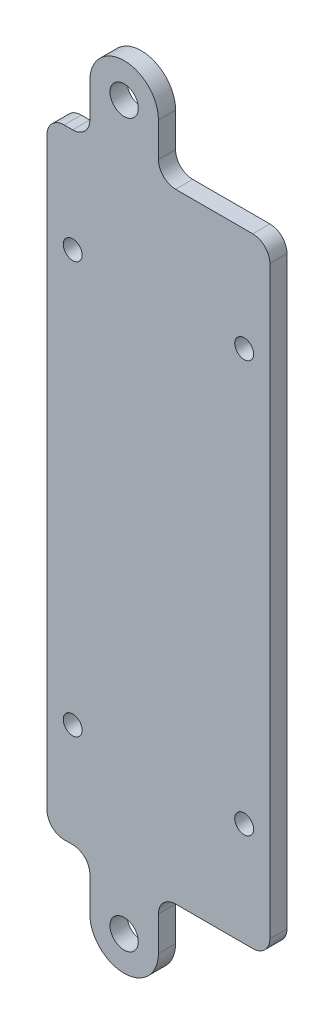
ISO-10303-21;
HEADER;
FILE_DESCRIPTION(('STEP AP214'),'2;1');
FILE_NAME('part.step','',(''),(''),'','','');
FILE_SCHEMA(('AUTOMOTIVE_DESIGN { 1 0 10303 214 1 1 1 1 }'));
ENDSEC;
DATA;
#1=APPLICATION_CONTEXT('core data for automotive mechanical design processes');
#2=APPLICATION_PROTOCOL_DEFINITION('international standard','automotive_design',2000,#1);
#3=PRODUCT_CONTEXT('',#1,'mechanical');
#4=PRODUCT('Part','Part','',(#3));
#5=PRODUCT_RELATED_PRODUCT_CATEGORY('part','',(#4));
#6=PRODUCT_DEFINITION_FORMATION('','',#4);
#7=PRODUCT_DEFINITION_CONTEXT('part definition',#1,'design');
#8=PRODUCT_DEFINITION('design','',#6,#7);
#9=PRODUCT_DEFINITION_SHAPE('','',#8);
#10=(LENGTH_UNIT() NAMED_UNIT(*) SI_UNIT(.MILLI.,.METRE.));
#11=(NAMED_UNIT(*) PLANE_ANGLE_UNIT() SI_UNIT($,.RADIAN.));
#12=(NAMED_UNIT(*) SI_UNIT($,.STERADIAN.) SOLID_ANGLE_UNIT());
#13=UNCERTAINTY_MEASURE_WITH_UNIT(LENGTH_MEASURE(1.E-05),#10,'distance_accuracy_value','');
#14=(GEOMETRIC_REPRESENTATION_CONTEXT(3) GLOBAL_UNCERTAINTY_ASSIGNED_CONTEXT((#13)) GLOBAL_UNIT_ASSIGNED_CONTEXT((#10,
#11,#12)) REPRESENTATION_CONTEXT('',''));
#15=CARTESIAN_POINT('',(0.,0.,0.));
#16=DIRECTION('',(0.,0.,1.));
#17=DIRECTION('',(1.,0.,0.));
#18=AXIS2_PLACEMENT_3D('',#15,#16,#17);
#19=CARTESIAN_POINT('',(13.,-36.1,2.));
#20=DIRECTION('',(0.,1.,0.));
#21=DIRECTION('',(0.,0.,1.));
#22=AXIS2_PLACEMENT_3D('',#19,#20,#21);
#23=PLANE('',#22);
#24=DIRECTION('',(1.,0.,0.));
#25=VECTOR('',#24,1.);
#26=CARTESIAN_POINT('',(13.,-36.1,0.));
#27=LINE('',#26,#25);
#28=CARTESIAN_POINT('',(2.00000000000001,-36.1,0.));
#29=VERTEX_POINT('',#28);
#30=CARTESIAN_POINT('',(11.,-36.1,0.));
#31=VERTEX_POINT('',#30);
#32=EDGE_CURVE('E278',#29,#31,#27,.T.);
#33=ORIENTED_EDGE('',*,*,#32,.T.);
#34=DIRECTION('',(0.,0.,-1.));
#35=VECTOR('',#34,1.);
#36=CARTESIAN_POINT('',(11.,-36.1,2.));
#37=LINE('',#36,#35);
#38=CARTESIAN_POINT('',(11.,-36.1,2.));
#39=VERTEX_POINT('',#38);
#40=EDGE_CURVE('E329',#31,#39,#37,.F.);
#41=ORIENTED_EDGE('',*,*,#40,.T.);
#42=DIRECTION('',(1.,0.,0.));
#43=VECTOR('',#42,1.);
#44=CARTESIAN_POINT('',(13.,-36.1,2.));
#45=LINE('',#44,#43);
#46=CARTESIAN_POINT('',(2.00000000000001,-36.1,2.));
#47=VERTEX_POINT('',#46);
#48=EDGE_CURVE('E264',#47,#39,#45,.T.);
#49=ORIENTED_EDGE('',*,*,#48,.F.);
#50=DIRECTION('',(0.,0.,1.));
#51=VECTOR('',#50,1.);
#52=CARTESIAN_POINT('',(2.00000000000001,-36.1,2.));
#53=LINE('',#52,#51);
#54=EDGE_CURVE('E327',#47,#29,#53,.F.);
#55=ORIENTED_EDGE('',*,*,#54,.T.);
#56=EDGE_LOOP('',(#33,#41,#49,#55));
#57=FACE_BOUND('',#56,.T.);
#58=ADVANCED_FACE('F36',(#57),#23,.F.);
#59=CARTESIAN_POINT('',(13.,36.1,2.));
#60=DIRECTION('',(0.,-1.,0.));
#61=DIRECTION('',(0.,0.,-1.));
#62=AXIS2_PLACEMENT_3D('',#59,#60,#61);
#63=PLANE('',#62);
#64=DIRECTION('',(-1.,0.,0.));
#65=VECTOR('',#64,1.);
#66=CARTESIAN_POINT('',(13.,36.1,2.));
#67=LINE('',#66,#65);
#68=CARTESIAN_POINT('',(-10.,36.1,2.));
#69=VERTEX_POINT('',#68);
#70=CARTESIAN_POINT('',(-11.,36.1,2.));
#71=VERTEX_POINT('',#70);
#72=EDGE_CURVE('E272',#69,#71,#67,.T.);
#73=ORIENTED_EDGE('',*,*,#72,.F.);
#74=DIRECTION('',(0.,0.,1.));
#75=VECTOR('',#74,1.);
#76=CARTESIAN_POINT('',(-10.,36.1,2.));
#77=LINE('',#76,#75);
#78=CARTESIAN_POINT('',(-10.,36.1,0.));
#79=VERTEX_POINT('',#78);
#80=EDGE_CURVE('E292',#69,#79,#77,.F.);
#81=ORIENTED_EDGE('',*,*,#80,.T.);
#82=DIRECTION('',(-1.,0.,0.));
#83=VECTOR('',#82,1.);
#84=CARTESIAN_POINT('',(13.,36.1,0.));
#85=LINE('',#84,#83);
#86=CARTESIAN_POINT('',(-11.,36.1,0.));
#87=VERTEX_POINT('',#86);
#88=EDGE_CURVE('E285',#79,#87,#85,.T.);
#89=ORIENTED_EDGE('',*,*,#88,.T.);
#90=DIRECTION('',(0.,0.,-1.));
#91=VECTOR('',#90,1.);
#92=CARTESIAN_POINT('',(-11.,36.1,2.));
#93=LINE('',#92,#91);
#94=EDGE_CURVE('E290',#87,#71,#93,.F.);
#95=ORIENTED_EDGE('',*,*,#94,.T.);
#96=EDGE_LOOP('',(#73,#81,#89,#95));
#97=FACE_BOUND('',#96,.T.);
#98=ADVANCED_FACE('F385',(#97),#63,.F.);
#99=CARTESIAN_POINT('',(0.,0.,2.));
#100=DIRECTION('',(0.,0.,1.));
#101=DIRECTION('',(1.,0.,0.));
#102=AXIS2_PLACEMENT_3D('',#99,#100,#101);
#103=PLANE('',#102);
#104=CARTESIAN_POINT('',(-10.,-24.,2.));
#105=DIRECTION('',(0.,0.,1.));
#106=DIRECTION('',(1.,0.,0.));
#107=AXIS2_PLACEMENT_3D('',#104,#105,#106);
#108=CIRCLE('',#107,1.1);
#109=CARTESIAN_POINT('',(-8.9,-24.,2.));
#110=VERTEX_POINT('',#109);
#111=EDGE_CURVE('E243',#110,#110,#108,.T.);
#112=ORIENTED_EDGE('',*,*,#111,.F.);
#113=EDGE_LOOP('',(#112));
#114=FACE_BOUND('',#113,.T.);
#115=CARTESIAN_POINT('',(-10.,24.,2.));
#116=DIRECTION('',(0.,0.,1.));
#117=DIRECTION('',(1.,0.,0.));
#118=AXIS2_PLACEMENT_3D('',#115,#116,#117);
#119=CIRCLE('',#118,1.1);
#120=CARTESIAN_POINT('',(-8.9,24.,2.));
#121=VERTEX_POINT('',#120);
#122=EDGE_CURVE('E255',#121,#121,#119,.T.);
#123=ORIENTED_EDGE('',*,*,#122,.F.);
#124=EDGE_LOOP('',(#123));
#125=FACE_BOUND('',#124,.T.);
#126=ORIENTED_EDGE('',*,*,#72,.T.);
#127=CARTESIAN_POINT('',(-11.,34.1,2.));
#128=DIRECTION('',(0.,0.,1.));
#129=DIRECTION('',(1.,0.,0.));
#130=AXIS2_PLACEMENT_3D('',#127,#128,#129);
#131=CIRCLE('',#130,2.);
#132=CARTESIAN_POINT('',(-13.,34.1,2.));
#133=VERTEX_POINT('',#132);
#134=EDGE_CURVE('E313',#71,#133,#131,.T.);
#135=ORIENTED_EDGE('',*,*,#134,.T.);
#136=DIRECTION('',(0.,-1.,0.));
#137=VECTOR('',#136,1.);
#138=CARTESIAN_POINT('',(-13.,-36.1,2.));
#139=LINE('',#138,#137);
#140=CARTESIAN_POINT('',(-13.,-34.1,2.));
#141=VERTEX_POINT('',#140);
#142=EDGE_CURVE('E261',#133,#141,#139,.T.);
#143=ORIENTED_EDGE('',*,*,#142,.T.);
#144=CARTESIAN_POINT('',(-11.,-34.1,2.));
#145=DIRECTION('',(0.,0.,1.));
#146=DIRECTION('',(1.,0.,0.));
#147=AXIS2_PLACEMENT_3D('',#144,#145,#146);
#148=CIRCLE('',#147,2.);
#149=CARTESIAN_POINT('',(-11.,-36.1,2.));
#150=VERTEX_POINT('',#149);
#151=EDGE_CURVE('E307',#141,#150,#148,.T.);
#152=ORIENTED_EDGE('',*,*,#151,.T.);
#153=CARTESIAN_POINT('',(-9.99999999999999,-36.1,2.));
#154=VERTEX_POINT('',#153);
#155=EDGE_CURVE('E268',#150,#154,#45,.T.);
#156=ORIENTED_EDGE('',*,*,#155,.T.);
#157=CARTESIAN_POINT('',(-9.99999999999999,-38.1,2.));
#158=DIRECTION('',(0.,0.,1.));
#159=DIRECTION('',(1.,0.,0.));
#160=AXIS2_PLACEMENT_3D('',#157,#158,#159);
#161=CIRCLE('',#160,2.);
#162=CARTESIAN_POINT('',(-7.99999999999999,-38.1,2.));
#163=VERTEX_POINT('',#162);
#164=EDGE_CURVE('E44',#154,#163,#161,.F.);
#165=ORIENTED_EDGE('',*,*,#164,.T.);
#166=DIRECTION('',(0.,-1.,0.));
#167=VECTOR('',#166,1.);
#168=CARTESIAN_POINT('',(-7.99999999999999,-42.1,2.));
#169=LINE('',#168,#167);
#170=CARTESIAN_POINT('',(-7.99999999999999,-42.1,2.));
#171=VERTEX_POINT('',#170);
#172=EDGE_CURVE('E183',#163,#171,#169,.T.);
#173=ORIENTED_EDGE('',*,*,#172,.T.);
#174=CARTESIAN_POINT('',(-3.99999999999999,-42.1,2.));
#175=DIRECTION('',(0.,0.,1.));
#176=DIRECTION('',(1.,0.,0.));
#177=AXIS2_PLACEMENT_3D('',#174,#175,#176);
#178=CIRCLE('',#177,4.);
#179=CARTESIAN_POINT('',(0.,-42.1,2.));
#180=VERTEX_POINT('',#179);
#181=EDGE_CURVE('E178',#171,#180,#178,.T.);
#182=ORIENTED_EDGE('',*,*,#181,.T.);
#183=DIRECTION('',(0.,1.,0.));
#184=VECTOR('',#183,1.);
#185=CARTESIAN_POINT('',(0.,-42.1,2.));
#186=LINE('',#185,#184);
#187=CARTESIAN_POINT('',(0.,-38.1,2.));
#188=VERTEX_POINT('',#187);
#189=EDGE_CURVE('E187',#180,#188,#186,.T.);
#190=ORIENTED_EDGE('',*,*,#189,.T.);
#191=CARTESIAN_POINT('',(2.00000000000001,-38.1,2.));
#192=DIRECTION('',(0.,0.,1.));
#193=DIRECTION('',(1.,0.,0.));
#194=AXIS2_PLACEMENT_3D('',#191,#192,#193);
#195=CIRCLE('',#194,2.);
#196=EDGE_CURVE('E347',#188,#47,#195,.F.);
#197=ORIENTED_EDGE('',*,*,#196,.T.);
#198=ORIENTED_EDGE('',*,*,#48,.T.);
#199=CARTESIAN_POINT('',(11.,-34.1,2.));
#200=DIRECTION('',(0.,0.,1.));
#201=DIRECTION('',(1.,0.,0.));
#202=AXIS2_PLACEMENT_3D('',#199,#200,#201);
#203=CIRCLE('',#202,2.);
#204=CARTESIAN_POINT('',(13.,-34.1,2.));
#205=VERTEX_POINT('',#204);
#206=EDGE_CURVE('E309',#39,#205,#203,.T.);
#207=ORIENTED_EDGE('',*,*,#206,.T.);
#208=DIRECTION('',(0.,1.,0.));
#209=VECTOR('',#208,1.);
#210=CARTESIAN_POINT('',(13.,-36.1,2.));
#211=LINE('',#210,#209);
#212=CARTESIAN_POINT('',(13.,34.1,2.));
#213=VERTEX_POINT('',#212);
#214=EDGE_CURVE('E269',#205,#213,#211,.T.);
#215=ORIENTED_EDGE('',*,*,#214,.T.);
#216=CARTESIAN_POINT('',(11.,34.1,2.));
#217=DIRECTION('',(0.,0.,1.));
#218=DIRECTION('',(1.,0.,0.));
#219=AXIS2_PLACEMENT_3D('',#216,#217,#218);
#220=CIRCLE('',#219,2.);
#221=CARTESIAN_POINT('',(11.,36.1,2.));
#222=VERTEX_POINT('',#221);
#223=EDGE_CURVE('E311',#213,#222,#220,.T.);
#224=ORIENTED_EDGE('',*,*,#223,.T.);
#225=CARTESIAN_POINT('',(2.,36.1,2.));
#226=VERTEX_POINT('',#225);
#227=EDGE_CURVE('E273',#222,#226,#67,.T.);
#228=ORIENTED_EDGE('',*,*,#227,.T.);
#229=CARTESIAN_POINT('',(2.,38.1,2.));
#230=DIRECTION('',(0.,0.,1.));
#231=DIRECTION('',(1.,0.,0.));
#232=AXIS2_PLACEMENT_3D('',#229,#230,#231);
#233=CIRCLE('',#232,2.);
#234=CARTESIAN_POINT('',(0.,38.1,2.));
#235=VERTEX_POINT('',#234);
#236=EDGE_CURVE('E51',#226,#235,#233,.F.);
#237=ORIENTED_EDGE('',*,*,#236,.T.);
#238=DIRECTION('',(0.,1.,0.));
#239=VECTOR('',#238,1.);
#240=CARTESIAN_POINT('',(0.,42.1,2.));
#241=LINE('',#240,#239);
#242=CARTESIAN_POINT('',(0.,42.1,2.));
#243=VERTEX_POINT('',#242);
#244=EDGE_CURVE('E228',#235,#243,#241,.T.);
#245=ORIENTED_EDGE('',*,*,#244,.T.);
#246=CARTESIAN_POINT('',(-4.,42.1,2.));
#247=DIRECTION('',(0.,0.,1.));
#248=DIRECTION('',(1.,0.,0.));
#249=AXIS2_PLACEMENT_3D('',#246,#247,#248);
#250=CIRCLE('',#249,4.);
#251=CARTESIAN_POINT('',(-8.,42.1,2.));
#252=VERTEX_POINT('',#251);
#253=EDGE_CURVE('E222',#243,#252,#250,.T.);
#254=ORIENTED_EDGE('',*,*,#253,.T.);
#255=DIRECTION('',(0.,-1.,0.));
#256=VECTOR('',#255,1.);
#257=CARTESIAN_POINT('',(-8.,42.1,2.));
#258=LINE('',#257,#256);
#259=CARTESIAN_POINT('',(-8.00000000000001,38.1,2.));
#260=VERTEX_POINT('',#259);
#261=EDGE_CURVE('E225',#252,#260,#258,.T.);
#262=ORIENTED_EDGE('',*,*,#261,.T.);
#263=CARTESIAN_POINT('',(-10.,38.1,2.));
#264=DIRECTION('',(0.,0.,1.));
#265=DIRECTION('',(1.,0.,0.));
#266=AXIS2_PLACEMENT_3D('',#263,#264,#265);
#267=CIRCLE('',#266,2.);
#268=EDGE_CURVE('E340',#260,#69,#267,.F.);
#269=ORIENTED_EDGE('',*,*,#268,.T.);
#270=EDGE_LOOP('',(#126,#135,#143,#152,#156,#165,#173,#182,#190,#197,#198,#207,#215,#224,#228,
#237,#245,#254,#262,#269));
#271=FACE_BOUND('',#270,.T.);
#272=CARTESIAN_POINT('',(10.,24.,2.));
#273=DIRECTION('',(0.,0.,1.));
#274=DIRECTION('',(1.,0.,0.));
#275=AXIS2_PLACEMENT_3D('',#272,#273,#274);
#276=CIRCLE('',#275,1.1);
#277=CARTESIAN_POINT('',(11.1,24.,2.));
#278=VERTEX_POINT('',#277);
#279=EDGE_CURVE('E249',#278,#278,#276,.T.);
#280=ORIENTED_EDGE('',*,*,#279,.F.);
#281=EDGE_LOOP('',(#280));
#282=FACE_BOUND('',#281,.T.);
#283=CARTESIAN_POINT('',(10.,-24.,2.));
#284=DIRECTION('',(0.,0.,1.));
#285=DIRECTION('',(1.,0.,0.));
#286=AXIS2_PLACEMENT_3D('',#283,#284,#285);
#287=CIRCLE('',#286,1.1);
#288=CARTESIAN_POINT('',(11.1,-24.,2.));
#289=VERTEX_POINT('',#288);
#290=EDGE_CURVE('E237',#289,#289,#287,.T.);
#291=ORIENTED_EDGE('',*,*,#290,.F.);
#292=EDGE_LOOP('',(#291));
#293=FACE_BOUND('',#292,.T.);
#294=CARTESIAN_POINT('',(-4.,42.1,2.));
#295=DIRECTION('',(0.,0.,1.));
#296=DIRECTION('',(1.,0.,0.));
#297=AXIS2_PLACEMENT_3D('',#294,#295,#296);
#298=CIRCLE('',#297,1.65);
#299=CARTESIAN_POINT('',(-2.35,42.1,2.));
#300=VERTEX_POINT('',#299);
#301=EDGE_CURVE('E209',#300,#300,#298,.T.);
#302=ORIENTED_EDGE('',*,*,#301,.F.);
#303=EDGE_LOOP('',(#302));
#304=FACE_BOUND('',#303,.T.);
#305=CARTESIAN_POINT('',(-3.99999999999999,-42.1,2.));
#306=DIRECTION('',(0.,0.,1.));
#307=DIRECTION('',(1.,0.,0.));
#308=AXIS2_PLACEMENT_3D('',#305,#306,#307);
#309=CIRCLE('',#308,1.65);
#310=CARTESIAN_POINT('',(-2.34999999999999,-42.1,2.));
#311=VERTEX_POINT('',#310);
#312=EDGE_CURVE('E197',#311,#311,#309,.T.);
#313=ORIENTED_EDGE('',*,*,#312,.F.);
#314=EDGE_LOOP('',(#313));
#315=FACE_BOUND('',#314,.T.);
#316=ADVANCED_FACE('F193',(#114,#125,#271,#282,#293,#304,#315),#103,.T.);
#317=CARTESIAN_POINT('',(0.,0.,0.));
#318=DIRECTION('',(0.,0.,1.));
#319=DIRECTION('',(1.,0.,0.));
#320=AXIS2_PLACEMENT_3D('',#317,#318,#319);
#321=PLANE('',#320);
#322=DIRECTION('',(0.,-1.,0.));
#323=VECTOR('',#322,1.);
#324=CARTESIAN_POINT('',(-13.,-36.1,0.));
#325=LINE('',#324,#323);
#326=CARTESIAN_POINT('',(-13.,34.1,0.));
#327=VERTEX_POINT('',#326);
#328=CARTESIAN_POINT('',(-13.,-34.1,0.));
#329=VERTEX_POINT('',#328);
#330=EDGE_CURVE('E258',#327,#329,#325,.T.);
#331=ORIENTED_EDGE('',*,*,#330,.F.);
#332=CARTESIAN_POINT('',(-11.,34.1,0.));
#333=DIRECTION('',(0.,0.,1.));
#334=DIRECTION('',(1.,0.,0.));
#335=AXIS2_PLACEMENT_3D('',#332,#333,#334);
#336=CIRCLE('',#335,2.);
#337=EDGE_CURVE('E305',#327,#87,#336,.F.);
#338=ORIENTED_EDGE('',*,*,#337,.T.);
#339=ORIENTED_EDGE('',*,*,#88,.F.);
#340=CARTESIAN_POINT('',(-10.,38.1,0.));
#341=DIRECTION('',(0.,0.,1.));
#342=DIRECTION('',(1.,0.,0.));
#343=AXIS2_PLACEMENT_3D('',#340,#341,#342);
#344=CIRCLE('',#343,2.);
#345=CARTESIAN_POINT('',(-8.00000000000001,38.1,0.));
#346=VERTEX_POINT('',#345);
#347=EDGE_CURVE('E342',#79,#346,#344,.T.);
#348=ORIENTED_EDGE('',*,*,#347,.T.);
#349=DIRECTION('',(0.,1.,0.));
#350=VECTOR('',#349,1.);
#351=CARTESIAN_POINT('',(-8.,42.1,0.));
#352=LINE('',#351,#350);
#353=CARTESIAN_POINT('',(-8.,42.1,0.));
#354=VERTEX_POINT('',#353);
#355=EDGE_CURVE('E211',#346,#354,#352,.T.);
#356=ORIENTED_EDGE('',*,*,#355,.T.);
#357=CARTESIAN_POINT('',(-4.,42.1,0.));
#358=DIRECTION('',(0.,0.,1.));
#359=DIRECTION('',(1.,0.,0.));
#360=AXIS2_PLACEMENT_3D('',#357,#358,#359);
#361=CIRCLE('',#360,4.);
#362=CARTESIAN_POINT('',(0.,42.1,0.));
#363=VERTEX_POINT('',#362);
#364=EDGE_CURVE('E214',#354,#363,#361,.F.);
#365=ORIENTED_EDGE('',*,*,#364,.T.);
#366=DIRECTION('',(0.,-1.,0.));
#367=VECTOR('',#366,1.);
#368=CARTESIAN_POINT('',(0.,42.1,0.));
#369=LINE('',#368,#367);
#370=CARTESIAN_POINT('',(0.,38.1,0.));
#371=VERTEX_POINT('',#370);
#372=EDGE_CURVE('E215',#363,#371,#369,.T.);
#373=ORIENTED_EDGE('',*,*,#372,.T.);
#374=CARTESIAN_POINT('',(2.,38.1,0.));
#375=DIRECTION('',(0.,0.,1.));
#376=DIRECTION('',(1.,0.,0.));
#377=AXIS2_PLACEMENT_3D('',#374,#375,#376);
#378=CIRCLE('',#377,2.);
#379=CARTESIAN_POINT('',(2.,36.1,0.));
#380=VERTEX_POINT('',#379);
#381=EDGE_CURVE('E345',#371,#380,#378,.T.);
#382=ORIENTED_EDGE('',*,*,#381,.T.);
#383=CARTESIAN_POINT('',(11.,36.1,0.));
#384=VERTEX_POINT('',#383);
#385=EDGE_CURVE('E265',#384,#380,#85,.T.);
#386=ORIENTED_EDGE('',*,*,#385,.F.);
#387=CARTESIAN_POINT('',(11.,34.1,0.));
#388=DIRECTION('',(0.,0.,1.));
#389=DIRECTION('',(1.,0.,0.));
#390=AXIS2_PLACEMENT_3D('',#387,#388,#389);
#391=CIRCLE('',#390,2.);
#392=CARTESIAN_POINT('',(13.,34.1,0.));
#393=VERTEX_POINT('',#392);
#394=EDGE_CURVE('E303',#384,#393,#391,.F.);
#395=ORIENTED_EDGE('',*,*,#394,.T.);
#396=DIRECTION('',(0.,1.,0.));
#397=VECTOR('',#396,1.);
#398=CARTESIAN_POINT('',(13.,-36.1,0.));
#399=LINE('',#398,#397);
#400=CARTESIAN_POINT('',(13.,-34.1,0.));
#401=VERTEX_POINT('',#400);
#402=EDGE_CURVE('E282',#401,#393,#399,.T.);
#403=ORIENTED_EDGE('',*,*,#402,.F.);
#404=CARTESIAN_POINT('',(11.,-34.1,0.));
#405=DIRECTION('',(0.,0.,1.));
#406=DIRECTION('',(1.,0.,0.));
#407=AXIS2_PLACEMENT_3D('',#404,#405,#406);
#408=CIRCLE('',#407,2.);
#409=EDGE_CURVE('E301',#401,#31,#408,.F.);
#410=ORIENTED_EDGE('',*,*,#409,.T.);
#411=ORIENTED_EDGE('',*,*,#32,.F.);
#412=CARTESIAN_POINT('',(2.00000000000001,-38.1,0.));
#413=DIRECTION('',(0.,0.,1.));
#414=DIRECTION('',(1.,0.,0.));
#415=AXIS2_PLACEMENT_3D('',#412,#413,#414);
#416=CIRCLE('',#415,2.);
#417=CARTESIAN_POINT('',(0.,-38.1,0.));
#418=VERTEX_POINT('',#417);
#419=EDGE_CURVE('E349',#29,#418,#416,.T.);
#420=ORIENTED_EDGE('',*,*,#419,.T.);
#421=DIRECTION('',(0.,-1.,0.));
#422=VECTOR('',#421,1.);
#423=CARTESIAN_POINT('',(0.,-42.1,0.));
#424=LINE('',#423,#422);
#425=CARTESIAN_POINT('',(0.,-42.1,0.));
#426=VERTEX_POINT('',#425);
#427=EDGE_CURVE('E210',#418,#426,#424,.T.);
#428=ORIENTED_EDGE('',*,*,#427,.T.);
#429=CARTESIAN_POINT('',(-3.99999999999999,-42.1,0.));
#430=DIRECTION('',(0.,0.,1.));
#431=DIRECTION('',(1.,0.,0.));
#432=AXIS2_PLACEMENT_3D('',#429,#430,#431);
#433=CIRCLE('',#432,4.);
#434=CARTESIAN_POINT('',(-7.99999999999999,-42.1,0.));
#435=VERTEX_POINT('',#434);
#436=EDGE_CURVE('E179',#426,#435,#433,.F.);
#437=ORIENTED_EDGE('',*,*,#436,.T.);
#438=DIRECTION('',(0.,1.,0.));
#439=VECTOR('',#438,1.);
#440=CARTESIAN_POINT('',(-7.99999999999999,-42.1,0.));
#441=LINE('',#440,#439);
#442=CARTESIAN_POINT('',(-7.99999999999999,-38.1,0.));
#443=VERTEX_POINT('',#442);
#444=EDGE_CURVE('E204',#435,#443,#441,.T.);
#445=ORIENTED_EDGE('',*,*,#444,.T.);
#446=CARTESIAN_POINT('',(-9.99999999999999,-38.1,0.));
#447=DIRECTION('',(0.,0.,1.));
#448=DIRECTION('',(1.,0.,0.));
#449=AXIS2_PLACEMENT_3D('',#446,#447,#448);
#450=CIRCLE('',#449,2.);
#451=CARTESIAN_POINT('',(-9.99999999999999,-36.1,0.));
#452=VERTEX_POINT('',#451);
#453=EDGE_CURVE('E11',#443,#452,#450,.T.);
#454=ORIENTED_EDGE('',*,*,#453,.T.);
#455=CARTESIAN_POINT('',(-11.,-36.1,0.));
#456=VERTEX_POINT('',#455);
#457=EDGE_CURVE('E279',#456,#452,#27,.T.);
#458=ORIENTED_EDGE('',*,*,#457,.F.);
#459=CARTESIAN_POINT('',(-11.,-34.1,0.));
#460=DIRECTION('',(0.,0.,1.));
#461=DIRECTION('',(1.,0.,0.));
#462=AXIS2_PLACEMENT_3D('',#459,#460,#461);
#463=CIRCLE('',#462,2.);
#464=EDGE_CURVE('E299',#456,#329,#463,.F.);
#465=ORIENTED_EDGE('',*,*,#464,.T.);
#466=EDGE_LOOP('',(#331,#338,#339,#348,#356,#365,#373,#382,#386,#395,#403,#410,#411,#420,#428,
#437,#445,#454,#458,#465));
#467=FACE_BOUND('',#466,.T.);
#468=CARTESIAN_POINT('',(-10.,24.,0.));
#469=DIRECTION('',(0.,0.,1.));
#470=DIRECTION('',(1.,0.,0.));
#471=AXIS2_PLACEMENT_3D('',#468,#469,#470);
#472=CIRCLE('',#471,1.1);
#473=CARTESIAN_POINT('',(-8.9,24.,0.));
#474=VERTEX_POINT('',#473);
#475=EDGE_CURVE('E252',#474,#474,#472,.T.);
#476=ORIENTED_EDGE('',*,*,#475,.T.);
#477=EDGE_LOOP('',(#476));
#478=FACE_BOUND('',#477,.T.);
#479=CARTESIAN_POINT('',(10.,24.,0.));
#480=DIRECTION('',(0.,0.,1.));
#481=DIRECTION('',(1.,0.,0.));
#482=AXIS2_PLACEMENT_3D('',#479,#480,#481);
#483=CIRCLE('',#482,1.1);
#484=CARTESIAN_POINT('',(11.1,24.,0.));
#485=VERTEX_POINT('',#484);
#486=EDGE_CURVE('E246',#485,#485,#483,.T.);
#487=ORIENTED_EDGE('',*,*,#486,.T.);
#488=EDGE_LOOP('',(#487));
#489=FACE_BOUND('',#488,.T.);
#490=CARTESIAN_POINT('',(-10.,-24.,0.));
#491=DIRECTION('',(0.,0.,1.));
#492=DIRECTION('',(1.,0.,0.));
#493=AXIS2_PLACEMENT_3D('',#490,#491,#492);
#494=CIRCLE('',#493,1.1);
#495=CARTESIAN_POINT('',(-8.9,-24.,0.));
#496=VERTEX_POINT('',#495);
#497=EDGE_CURVE('E240',#496,#496,#494,.T.);
#498=ORIENTED_EDGE('',*,*,#497,.T.);
#499=EDGE_LOOP('',(#498));
#500=FACE_BOUND('',#499,.T.);
#501=CARTESIAN_POINT('',(10.,-24.,0.));
#502=DIRECTION('',(0.,0.,1.));
#503=DIRECTION('',(1.,0.,0.));
#504=AXIS2_PLACEMENT_3D('',#501,#502,#503);
#505=CIRCLE('',#504,1.1);
#506=CARTESIAN_POINT('',(11.1,-24.,0.));
#507=VERTEX_POINT('',#506);
#508=EDGE_CURVE('E236',#507,#507,#505,.T.);
#509=ORIENTED_EDGE('',*,*,#508,.T.);
#510=EDGE_LOOP('',(#509));
#511=FACE_BOUND('',#510,.T.);
#512=CARTESIAN_POINT('',(-4.,42.1,0.));
#513=DIRECTION('',(0.,0.,1.));
#514=DIRECTION('',(1.,0.,0.));
#515=AXIS2_PLACEMENT_3D('',#512,#513,#514);
#516=CIRCLE('',#515,1.65);
#517=CARTESIAN_POINT('',(-2.35,42.1,0.));
#518=VERTEX_POINT('',#517);
#519=EDGE_CURVE('E213',#518,#518,#516,.F.);
#520=ORIENTED_EDGE('',*,*,#519,.F.);
#521=EDGE_LOOP('',(#520));
#522=FACE_BOUND('',#521,.T.);
#523=CARTESIAN_POINT('',(-3.99999999999999,-42.1,0.));
#524=DIRECTION('',(0.,0.,1.));
#525=DIRECTION('',(1.,0.,0.));
#526=AXIS2_PLACEMENT_3D('',#523,#524,#525);
#527=CIRCLE('',#526,1.65);
#528=CARTESIAN_POINT('',(-2.34999999999999,-42.1,0.));
#529=VERTEX_POINT('',#528);
#530=EDGE_CURVE('E206',#529,#529,#527,.F.);
#531=ORIENTED_EDGE('',*,*,#530,.F.);
#532=EDGE_LOOP('',(#531));
#533=FACE_BOUND('',#532,.T.);
#534=ADVANCED_FACE('F363',(#467,#478,#489,#500,#511,#522,#533),#321,.F.);
#535=CARTESIAN_POINT('',(-13.,-36.1,2.));
#536=DIRECTION('',(1.,0.,0.));
#537=DIRECTION('',(0.,0.,-1.));
#538=AXIS2_PLACEMENT_3D('',#535,#536,#537);
#539=PLANE('',#538);
#540=ORIENTED_EDGE('',*,*,#142,.F.);
#541=DIRECTION('',(0.,0.,-1.));
#542=VECTOR('',#541,1.);
#543=CARTESIAN_POINT('',(-13.,34.1,2.));
#544=LINE('',#543,#542);
#545=EDGE_CURVE('E296',#133,#327,#544,.T.);
#546=ORIENTED_EDGE('',*,*,#545,.T.);
#547=ORIENTED_EDGE('',*,*,#330,.T.);
#548=DIRECTION('',(0.,0.,-1.));
#549=VECTOR('',#548,1.);
#550=CARTESIAN_POINT('',(-13.,-34.1,2.));
#551=LINE('',#550,#549);
#552=EDGE_CURVE('E294',#329,#141,#551,.F.);
#553=ORIENTED_EDGE('',*,*,#552,.T.);
#554=EDGE_LOOP('',(#540,#546,#547,#553));
#555=FACE_BOUND('',#554,.T.);
#556=ADVANCED_FACE('F374',(#555),#539,.F.);
#557=ORIENTED_EDGE('',*,*,#155,.F.);
#558=DIRECTION('',(0.,0.,-1.));
#559=VECTOR('',#558,1.);
#560=CARTESIAN_POINT('',(-11.,-36.1,2.));
#561=LINE('',#560,#559);
#562=EDGE_CURVE('E335',#150,#456,#561,.T.);
#563=ORIENTED_EDGE('',*,*,#562,.T.);
#564=ORIENTED_EDGE('',*,*,#457,.T.);
#565=DIRECTION('',(0.,0.,1.));
#566=VECTOR('',#565,1.);
#567=CARTESIAN_POINT('',(-9.99999999999999,-36.1,2.));
#568=LINE('',#567,#566);
#569=EDGE_CURVE('E332',#452,#154,#568,.T.);
#570=ORIENTED_EDGE('',*,*,#569,.T.);
#571=EDGE_LOOP('',(#557,#563,#564,#570));
#572=FACE_BOUND('',#571,.T.);
#573=ADVANCED_FACE('F366',(#572),#23,.F.);
#574=CARTESIAN_POINT('',(13.,-36.1,2.));
#575=DIRECTION('',(-1.,0.,0.));
#576=DIRECTION('',(0.,0.,1.));
#577=AXIS2_PLACEMENT_3D('',#574,#575,#576);
#578=PLANE('',#577);
#579=ORIENTED_EDGE('',*,*,#402,.T.);
#580=DIRECTION('',(0.,0.,-1.));
#581=VECTOR('',#580,1.);
#582=CARTESIAN_POINT('',(13.,34.1,2.));
#583=LINE('',#582,#581);
#584=EDGE_CURVE('E325',#393,#213,#583,.F.);
#585=ORIENTED_EDGE('',*,*,#584,.T.);
#586=ORIENTED_EDGE('',*,*,#214,.F.);
#587=DIRECTION('',(0.,0.,-1.));
#588=VECTOR('',#587,1.);
#589=CARTESIAN_POINT('',(13.,-34.1,2.));
#590=LINE('',#589,#588);
#591=EDGE_CURVE('E322',#205,#401,#590,.T.);
#592=ORIENTED_EDGE('',*,*,#591,.T.);
#593=EDGE_LOOP('',(#579,#585,#586,#592));
#594=FACE_BOUND('',#593,.T.);
#595=ADVANCED_FACE('F416',(#594),#578,.F.);
#596=ORIENTED_EDGE('',*,*,#385,.T.);
#597=DIRECTION('',(0.,0.,1.));
#598=VECTOR('',#597,1.);
#599=CARTESIAN_POINT('',(2.,36.1,2.));
#600=LINE('',#599,#598);
#601=EDGE_CURVE('E318',#380,#226,#600,.T.);
#602=ORIENTED_EDGE('',*,*,#601,.T.);
#603=ORIENTED_EDGE('',*,*,#227,.F.);
#604=DIRECTION('',(0.,0.,-1.));
#605=VECTOR('',#604,1.);
#606=CARTESIAN_POINT('',(11.,36.1,2.));
#607=LINE('',#606,#605);
#608=EDGE_CURVE('E315',#222,#384,#607,.T.);
#609=ORIENTED_EDGE('',*,*,#608,.T.);
#610=EDGE_LOOP('',(#596,#602,#603,#609));
#611=FACE_BOUND('',#610,.T.);
#612=ADVANCED_FACE('F407',(#611),#63,.F.);
#613=CARTESIAN_POINT('',(-10.,24.,2.));
#614=DIRECTION('',(0.,0.,-1.));
#615=DIRECTION('',(-1.,0.,0.));
#616=AXIS2_PLACEMENT_3D('',#613,#614,#615);
#617=CYLINDRICAL_SURFACE('',#616,1.1);
#618=ORIENTED_EDGE('',*,*,#122,.T.);
#619=EDGE_LOOP('',(#618));
#620=FACE_BOUND('',#619,.T.);
#621=ORIENTED_EDGE('',*,*,#475,.F.);
#622=EDGE_LOOP('',(#621));
#623=FACE_BOUND('',#622,.T.);
#624=ADVANCED_FACE('F605',(#620,#623),#617,.F.);
#625=CARTESIAN_POINT('',(10.,24.,2.));
#626=DIRECTION('',(0.,0.,-1.));
#627=DIRECTION('',(-1.,0.,0.));
#628=AXIS2_PLACEMENT_3D('',#625,#626,#627);
#629=CYLINDRICAL_SURFACE('',#628,1.1);
#630=ORIENTED_EDGE('',*,*,#279,.T.);
#631=EDGE_LOOP('',(#630));
#632=FACE_BOUND('',#631,.T.);
#633=ORIENTED_EDGE('',*,*,#486,.F.);
#634=EDGE_LOOP('',(#633));
#635=FACE_BOUND('',#634,.T.);
#636=ADVANCED_FACE('F614',(#632,#635),#629,.F.);
#637=CARTESIAN_POINT('',(-10.,-24.,2.));
#638=DIRECTION('',(0.,0.,-1.));
#639=DIRECTION('',(-1.,0.,0.));
#640=AXIS2_PLACEMENT_3D('',#637,#638,#639);
#641=CYLINDRICAL_SURFACE('',#640,1.1);
#642=ORIENTED_EDGE('',*,*,#111,.T.);
#643=EDGE_LOOP('',(#642));
#644=FACE_BOUND('',#643,.T.);
#645=ORIENTED_EDGE('',*,*,#497,.F.);
#646=EDGE_LOOP('',(#645));
#647=FACE_BOUND('',#646,.T.);
#648=ADVANCED_FACE('F621',(#644,#647),#641,.F.);
#649=CARTESIAN_POINT('',(10.,-24.,2.));
#650=DIRECTION('',(0.,0.,-1.));
#651=DIRECTION('',(-1.,0.,0.));
#652=AXIS2_PLACEMENT_3D('',#649,#650,#651);
#653=CYLINDRICAL_SURFACE('',#652,1.1);
#654=ORIENTED_EDGE('',*,*,#290,.T.);
#655=EDGE_LOOP('',(#654));
#656=FACE_BOUND('',#655,.T.);
#657=ORIENTED_EDGE('',*,*,#508,.F.);
#658=EDGE_LOOP('',(#657));
#659=FACE_BOUND('',#658,.T.);
#660=ADVANCED_FACE('F570',(#656,#659),#653,.F.);
#661=CARTESIAN_POINT('',(-8.,42.1,-12.8062484748657));
#662=DIRECTION('',(-1.,0.,0.));
#663=DIRECTION('',(0.,-1.,0.));
#664=AXIS2_PLACEMENT_3D('',#661,#662,#663);
#665=PLANE('',#664);
#666=ORIENTED_EDGE('',*,*,#355,.F.);
#667=DIRECTION('',(0.,0.,1.));
#668=VECTOR('',#667,1.);
#669=CARTESIAN_POINT('',(-8.00000000000001,38.1,-12.8062484748657));
#670=LINE('',#669,#668);
#671=EDGE_CURVE('E275',#346,#260,#670,.T.);
#672=ORIENTED_EDGE('',*,*,#671,.T.);
#673=ORIENTED_EDGE('',*,*,#261,.F.);
#674=DIRECTION('',(0.,0.,1.));
#675=VECTOR('',#674,1.);
#676=CARTESIAN_POINT('',(-8.,42.1,-12.8062484748657));
#677=LINE('',#676,#675);
#678=EDGE_CURVE('E230',#354,#252,#677,.T.);
#679=ORIENTED_EDGE('',*,*,#678,.F.);
#680=EDGE_LOOP('',(#666,#672,#673,#679));
#681=FACE_BOUND('',#680,.T.);
#682=ADVANCED_FACE('F394',(#681),#665,.T.);
#683=CARTESIAN_POINT('',(0.,42.1,-12.8062484748657));
#684=DIRECTION('',(1.,0.,0.));
#685=DIRECTION('',(0.,1.,0.));
#686=AXIS2_PLACEMENT_3D('',#683,#684,#685);
#687=PLANE('',#686);
#688=ORIENTED_EDGE('',*,*,#244,.F.);
#689=DIRECTION('',(0.,0.,1.));
#690=VECTOR('',#689,1.);
#691=CARTESIAN_POINT('',(0.,38.1,-12.8062484748657));
#692=LINE('',#691,#690);
#693=EDGE_CURVE('E320',#235,#371,#692,.F.);
#694=ORIENTED_EDGE('',*,*,#693,.T.);
#695=ORIENTED_EDGE('',*,*,#372,.F.);
#696=DIRECTION('',(0.,0.,1.));
#697=VECTOR('',#696,1.);
#698=CARTESIAN_POINT('',(0.,42.1,-12.8062484748657));
#699=LINE('',#698,#697);
#700=EDGE_CURVE('E218',#363,#243,#699,.T.);
#701=ORIENTED_EDGE('',*,*,#700,.T.);
#702=EDGE_LOOP('',(#688,#694,#695,#701));
#703=FACE_BOUND('',#702,.T.);
#704=ADVANCED_FACE('F403',(#703),#687,.T.);
#705=CARTESIAN_POINT('',(-4.,42.1,-12.8062484748657));
#706=DIRECTION('',(0.,0.,1.));
#707=DIRECTION('',(1.,0.,0.));
#708=AXIS2_PLACEMENT_3D('',#705,#706,#707);
#709=CYLINDRICAL_SURFACE('',#708,4.);
#710=ORIENTED_EDGE('',*,*,#364,.F.);
#711=ORIENTED_EDGE('',*,*,#678,.T.);
#712=ORIENTED_EDGE('',*,*,#253,.F.);
#713=ORIENTED_EDGE('',*,*,#700,.F.);
#714=EDGE_LOOP('',(#710,#711,#712,#713));
#715=FACE_BOUND('',#714,.T.);
#716=ADVANCED_FACE('F398',(#715),#709,.T.);
#717=CARTESIAN_POINT('',(-4.,42.1,-12.8062484748657));
#718=DIRECTION('',(0.,0.,1.));
#719=DIRECTION('',(1.,0.,0.));
#720=AXIS2_PLACEMENT_3D('',#717,#718,#719);
#721=CYLINDRICAL_SURFACE('',#720,1.65);
#722=ORIENTED_EDGE('',*,*,#519,.T.);
#723=EDGE_LOOP('',(#722));
#724=FACE_BOUND('',#723,.T.);
#725=ORIENTED_EDGE('',*,*,#301,.T.);
#726=EDGE_LOOP('',(#725));
#727=FACE_BOUND('',#726,.T.);
#728=ADVANCED_FACE('F540',(#724,#727),#721,.F.);
#729=CARTESIAN_POINT('',(0.,-42.1,-12.8062484748657));
#730=DIRECTION('',(1.,0.,0.));
#731=DIRECTION('',(0.,0.,-1.));
#732=AXIS2_PLACEMENT_3D('',#729,#730,#731);
#733=PLANE('',#732);
#734=ORIENTED_EDGE('',*,*,#427,.F.);
#735=DIRECTION('',(0.,0.,1.));
#736=VECTOR('',#735,1.);
#737=CARTESIAN_POINT('',(0.,-38.1,-12.8062484748657));
#738=LINE('',#737,#736);
#739=EDGE_CURVE('E190',#418,#188,#738,.T.);
#740=ORIENTED_EDGE('',*,*,#739,.T.);
#741=ORIENTED_EDGE('',*,*,#189,.F.);
#742=DIRECTION('',(0.,0.,1.));
#743=VECTOR('',#742,1.);
#744=CARTESIAN_POINT('',(0.,-42.1,-12.8062484748657));
#745=LINE('',#744,#743);
#746=EDGE_CURVE('E173',#426,#180,#745,.T.);
#747=ORIENTED_EDGE('',*,*,#746,.F.);
#748=EDGE_LOOP('',(#734,#740,#741,#747));
#749=FACE_BOUND('',#748,.T.);
#750=ADVANCED_FACE('F188',(#749),#733,.T.);
#751=CARTESIAN_POINT('',(-7.99999999999999,-42.1,-12.8062484748657));
#752=DIRECTION('',(-1.,0.,0.));
#753=DIRECTION('',(0.,0.,1.));
#754=AXIS2_PLACEMENT_3D('',#751,#752,#753);
#755=PLANE('',#754);
#756=ORIENTED_EDGE('',*,*,#172,.F.);
#757=DIRECTION('',(0.,0.,1.));
#758=VECTOR('',#757,1.);
#759=CARTESIAN_POINT('',(-7.99999999999999,-38.1,-12.8062484748657));
#760=LINE('',#759,#758);
#761=EDGE_CURVE('E338',#163,#443,#760,.F.);
#762=ORIENTED_EDGE('',*,*,#761,.T.);
#763=ORIENTED_EDGE('',*,*,#444,.F.);
#764=DIRECTION('',(0.,0.,1.));
#765=VECTOR('',#764,1.);
#766=CARTESIAN_POINT('',(-7.99999999999999,-42.1,-12.8062484748657));
#767=LINE('',#766,#765);
#768=EDGE_CURVE('E182',#435,#171,#767,.T.);
#769=ORIENTED_EDGE('',*,*,#768,.T.);
#770=EDGE_LOOP('',(#756,#762,#763,#769));
#771=FACE_BOUND('',#770,.T.);
#772=ADVANCED_FACE('F356',(#771),#755,.T.);
#773=CARTESIAN_POINT('',(-3.99999999999999,-42.1,-12.8062484748657));
#774=DIRECTION('',(0.,0.,1.));
#775=DIRECTION('',(1.,0.,0.));
#776=AXIS2_PLACEMENT_3D('',#773,#774,#775);
#777=CYLINDRICAL_SURFACE('',#776,4.);
#778=ORIENTED_EDGE('',*,*,#436,.F.);
#779=ORIENTED_EDGE('',*,*,#746,.T.);
#780=ORIENTED_EDGE('',*,*,#181,.F.);
#781=ORIENTED_EDGE('',*,*,#768,.F.);
#782=EDGE_LOOP('',(#778,#779,#780,#781));
#783=FACE_BOUND('',#782,.T.);
#784=ADVANCED_FACE('F175',(#783),#777,.T.);
#785=CARTESIAN_POINT('',(-3.99999999999999,-42.1,-12.8062484748657));
#786=DIRECTION('',(0.,0.,1.));
#787=DIRECTION('',(1.,0.,0.));
#788=AXIS2_PLACEMENT_3D('',#785,#786,#787);
#789=CYLINDRICAL_SURFACE('',#788,1.65);
#790=ORIENTED_EDGE('',*,*,#530,.T.);
#791=EDGE_LOOP('',(#790));
#792=FACE_BOUND('',#791,.T.);
#793=ORIENTED_EDGE('',*,*,#312,.T.);
#794=EDGE_LOOP('',(#793));
#795=FACE_BOUND('',#794,.T.);
#796=ADVANCED_FACE('F460',(#792,#795),#789,.F.);
#797=CARTESIAN_POINT('',(-10.,38.1,-12.8062484748657));
#798=DIRECTION('',(0.,0.,1.));
#799=DIRECTION('',(1.,0.,0.));
#800=AXIS2_PLACEMENT_3D('',#797,#798,#799);
#801=CYLINDRICAL_SURFACE('',#800,2.);
#802=ORIENTED_EDGE('',*,*,#347,.F.);
#803=ORIENTED_EDGE('',*,*,#80,.F.);
#804=ORIENTED_EDGE('',*,*,#268,.F.);
#805=ORIENTED_EDGE('',*,*,#671,.F.);
#806=EDGE_LOOP('',(#802,#803,#804,#805));
#807=FACE_BOUND('',#806,.T.);
#808=ADVANCED_FACE('F388',(#807),#801,.F.);
#809=CARTESIAN_POINT('',(-11.,34.1,2.));
#810=DIRECTION('',(0.,0.,-1.));
#811=DIRECTION('',(-1.,0.,0.));
#812=AXIS2_PLACEMENT_3D('',#809,#810,#811);
#813=CYLINDRICAL_SURFACE('',#812,2.);
#814=ORIENTED_EDGE('',*,*,#134,.F.);
#815=ORIENTED_EDGE('',*,*,#94,.F.);
#816=ORIENTED_EDGE('',*,*,#337,.F.);
#817=ORIENTED_EDGE('',*,*,#545,.F.);
#818=EDGE_LOOP('',(#814,#815,#816,#817));
#819=FACE_BOUND('',#818,.T.);
#820=ADVANCED_FACE('F378',(#819),#813,.T.);
#821=CARTESIAN_POINT('',(2.,38.1,2.));
#822=DIRECTION('',(0.,0.,1.));
#823=DIRECTION('',(1.,0.,0.));
#824=AXIS2_PLACEMENT_3D('',#821,#822,#823);
#825=CYLINDRICAL_SURFACE('',#824,2.);
#826=ORIENTED_EDGE('',*,*,#381,.F.);
#827=ORIENTED_EDGE('',*,*,#693,.F.);
#828=ORIENTED_EDGE('',*,*,#236,.F.);
#829=ORIENTED_EDGE('',*,*,#601,.F.);
#830=EDGE_LOOP('',(#826,#827,#828,#829));
#831=FACE_BOUND('',#830,.T.);
#832=ADVANCED_FACE('F404',(#831),#825,.F.);
#833=CARTESIAN_POINT('',(11.,34.1,2.));
#834=DIRECTION('',(0.,0.,-1.));
#835=DIRECTION('',(-1.,0.,0.));
#836=AXIS2_PLACEMENT_3D('',#833,#834,#835);
#837=CYLINDRICAL_SURFACE('',#836,2.);
#838=ORIENTED_EDGE('',*,*,#223,.F.);
#839=ORIENTED_EDGE('',*,*,#584,.F.);
#840=ORIENTED_EDGE('',*,*,#394,.F.);
#841=ORIENTED_EDGE('',*,*,#608,.F.);
#842=EDGE_LOOP('',(#838,#839,#840,#841));
#843=FACE_BOUND('',#842,.T.);
#844=ADVANCED_FACE('F412',(#843),#837,.T.);
#845=CARTESIAN_POINT('',(11.,-34.1,2.));
#846=DIRECTION('',(0.,0.,-1.));
#847=DIRECTION('',(-1.,0.,0.));
#848=AXIS2_PLACEMENT_3D('',#845,#846,#847);
#849=CYLINDRICAL_SURFACE('',#848,2.);
#850=ORIENTED_EDGE('',*,*,#206,.F.);
#851=ORIENTED_EDGE('',*,*,#40,.F.);
#852=ORIENTED_EDGE('',*,*,#409,.F.);
#853=ORIENTED_EDGE('',*,*,#591,.F.);
#854=EDGE_LOOP('',(#850,#851,#852,#853));
#855=FACE_BOUND('',#854,.T.);
#856=ADVANCED_FACE('F421',(#855),#849,.T.);
#857=CARTESIAN_POINT('',(2.00000000000001,-38.1,-12.8062484748657));
#858=DIRECTION('',(0.,0.,1.));
#859=DIRECTION('',(1.,0.,0.));
#860=AXIS2_PLACEMENT_3D('',#857,#858,#859);
#861=CYLINDRICAL_SURFACE('',#860,2.);
#862=ORIENTED_EDGE('',*,*,#419,.F.);
#863=ORIENTED_EDGE('',*,*,#54,.F.);
#864=ORIENTED_EDGE('',*,*,#196,.F.);
#865=ORIENTED_EDGE('',*,*,#739,.F.);
#866=EDGE_LOOP('',(#862,#863,#864,#865));
#867=FACE_BOUND('',#866,.T.);
#868=ADVANCED_FACE('F430',(#867),#861,.F.);
#869=CARTESIAN_POINT('',(-11.,-34.1,2.));
#870=DIRECTION('',(0.,0.,-1.));
#871=DIRECTION('',(-1.,0.,0.));
#872=AXIS2_PLACEMENT_3D('',#869,#870,#871);
#873=CYLINDRICAL_SURFACE('',#872,2.);
#874=ORIENTED_EDGE('',*,*,#151,.F.);
#875=ORIENTED_EDGE('',*,*,#552,.F.);
#876=ORIENTED_EDGE('',*,*,#464,.F.);
#877=ORIENTED_EDGE('',*,*,#562,.F.);
#878=EDGE_LOOP('',(#874,#875,#876,#877));
#879=FACE_BOUND('',#878,.T.);
#880=ADVANCED_FACE('F370',(#879),#873,.T.);
#881=CARTESIAN_POINT('',(-9.99999999999999,-38.1,2.));
#882=DIRECTION('',(0.,0.,1.));
#883=DIRECTION('',(1.,0.,0.));
#884=AXIS2_PLACEMENT_3D('',#881,#882,#883);
#885=CYLINDRICAL_SURFACE('',#884,2.);
#886=ORIENTED_EDGE('',*,*,#453,.F.);
#887=ORIENTED_EDGE('',*,*,#761,.F.);
#888=ORIENTED_EDGE('',*,*,#164,.F.);
#889=ORIENTED_EDGE('',*,*,#569,.F.);
#890=EDGE_LOOP('',(#886,#887,#888,#889));
#891=FACE_BOUND('',#890,.T.);
#892=ADVANCED_FACE('F38',(#891),#885,.F.);
#893=CLOSED_SHELL('',(#58,#98,#316,#534,#556,#573,#595,#612,#624,#636,#648,#660,#682,#704,#716,
#728,#750,#772,#784,#796,#808,#820,#832,#844,#856,#868,#880,#892));
#894=MANIFOLD_SOLID_BREP('B2',#893);
#895=ADVANCED_BREP_SHAPE_REPRESENTATION('',(#18,#894),#14);
#896=SHAPE_DEFINITION_REPRESENTATION(#9,#895);
ENDSEC;
END-ISO-10303-21;
